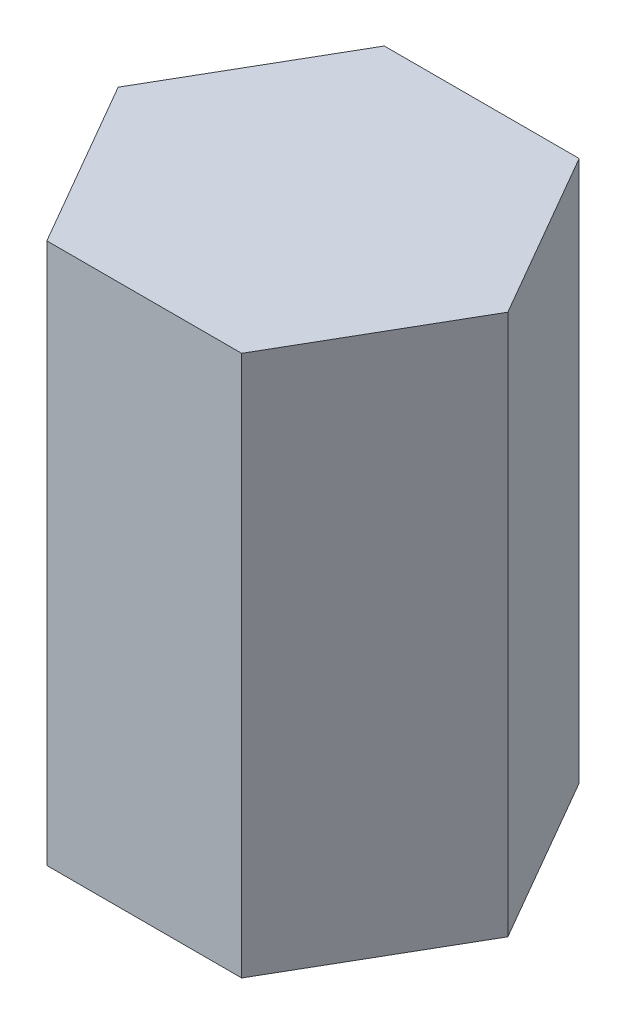
ISO-10303-21;
HEADER;
FILE_DESCRIPTION(('STEP AP214'),'2;1');
FILE_NAME('part.step','',(''),(''),'','','');
FILE_SCHEMA(('AUTOMOTIVE_DESIGN { 1 0 10303 214 1 1 1 1 }'));
ENDSEC;
DATA;
#1=APPLICATION_CONTEXT('core data for automotive mechanical design processes');
#2=APPLICATION_PROTOCOL_DEFINITION('international standard','automotive_design',2000,#1);
#3=PRODUCT_CONTEXT('',#1,'mechanical');
#4=PRODUCT('Part','Part','',(#3));
#5=PRODUCT_RELATED_PRODUCT_CATEGORY('part','',(#4));
#6=PRODUCT_DEFINITION_FORMATION('','',#4);
#7=PRODUCT_DEFINITION_CONTEXT('part definition',#1,'design');
#8=PRODUCT_DEFINITION('design','',#6,#7);
#9=PRODUCT_DEFINITION_SHAPE('','',#8);
#10=(LENGTH_UNIT() NAMED_UNIT(*) SI_UNIT(.MILLI.,.METRE.));
#11=(NAMED_UNIT(*) PLANE_ANGLE_UNIT() SI_UNIT($,.RADIAN.));
#12=(NAMED_UNIT(*) SI_UNIT($,.STERADIAN.) SOLID_ANGLE_UNIT());
#13=UNCERTAINTY_MEASURE_WITH_UNIT(LENGTH_MEASURE(1.E-05),#10,'distance_accuracy_value','');
#14=(GEOMETRIC_REPRESENTATION_CONTEXT(3) GLOBAL_UNCERTAINTY_ASSIGNED_CONTEXT((#13)) GLOBAL_UNIT_ASSIGNED_CONTEXT((#10,
#11,#12)) REPRESENTATION_CONTEXT('',''));
#15=CARTESIAN_POINT('',(0.,0.,0.));
#16=DIRECTION('',(0.,0.,1.));
#17=DIRECTION('',(1.,0.,0.));
#18=AXIS2_PLACEMENT_3D('',#15,#16,#17);
#19=CARTESIAN_POINT('',(288.675134594813,1603.,500.));
#20=DIRECTION('',(-0.866025403784439,0.,-0.5));
#21=DIRECTION('',(-0.5,0.,0.866025403784439));
#22=AXIS2_PLACEMENT_3D('',#19,#20,#21);
#23=PLANE('',#22);
#24=DIRECTION('',(0.5,0.,-0.866025403784439));
#25=VECTOR('',#24,1.);
#26=CARTESIAN_POINT('',(288.675134594813,0.,500.));
#27=LINE('',#26,#25);
#28=CARTESIAN_POINT('',(288.675134594813,0.,500.));
#29=VERTEX_POINT('',#28);
#30=CARTESIAN_POINT('',(577.350269189626,0.,0.));
#31=VERTEX_POINT('',#30);
#32=EDGE_CURVE('E129',#29,#31,#27,.T.);
#33=ORIENTED_EDGE('',*,*,#32,.T.);
#34=DIRECTION('',(0.,-1.,0.));
#35=VECTOR('',#34,1.);
#36=CARTESIAN_POINT('',(577.350269189626,1603.,0.));
#37=LINE('',#36,#35);
#38=CARTESIAN_POINT('',(577.350269189626,1603.,0.));
#39=VERTEX_POINT('',#38);
#40=EDGE_CURVE('E11',#39,#31,#37,.T.);
#41=ORIENTED_EDGE('',*,*,#40,.F.);
#42=DIRECTION('',(0.5,0.,-0.866025403784439));
#43=VECTOR('',#42,1.);
#44=CARTESIAN_POINT('',(288.675134594813,1603.,500.));
#45=LINE('',#44,#43);
#46=CARTESIAN_POINT('',(288.675134594813,1603.,500.));
#47=VERTEX_POINT('',#46);
#48=EDGE_CURVE('E140',#47,#39,#45,.T.);
#49=ORIENTED_EDGE('',*,*,#48,.F.);
#50=DIRECTION('',(0.,-1.,0.));
#51=VECTOR('',#50,1.);
#52=CARTESIAN_POINT('',(288.675134594813,1603.,500.));
#53=LINE('',#52,#51);
#54=EDGE_CURVE('E125',#47,#29,#53,.T.);
#55=ORIENTED_EDGE('',*,*,#54,.T.);
#56=EDGE_LOOP('',(#33,#41,#49,#55));
#57=FACE_BOUND('',#56,.T.);
#58=ADVANCED_FACE('F41',(#57),#23,.F.);
#59=CARTESIAN_POINT('',(577.350269189626,1603.,0.));
#60=DIRECTION('',(-0.866025403784439,0.,0.5));
#61=DIRECTION('',(0.5,0.,0.866025403784439));
#62=AXIS2_PLACEMENT_3D('',#59,#60,#61);
#63=PLANE('',#62);
#64=DIRECTION('',(-0.5,0.,-0.866025403784439));
#65=VECTOR('',#64,1.);
#66=CARTESIAN_POINT('',(577.350269189626,0.,0.));
#67=LINE('',#66,#65);
#68=CARTESIAN_POINT('',(288.675134594813,0.,-500.));
#69=VERTEX_POINT('',#68);
#70=EDGE_CURVE('E132',#31,#69,#67,.T.);
#71=ORIENTED_EDGE('',*,*,#70,.T.);
#72=DIRECTION('',(0.,-1.,0.));
#73=VECTOR('',#72,1.);
#74=CARTESIAN_POINT('',(288.675134594813,1603.,-500.));
#75=LINE('',#74,#73);
#76=CARTESIAN_POINT('',(288.675134594813,1603.,-500.));
#77=VERTEX_POINT('',#76);
#78=EDGE_CURVE('E49',#77,#69,#75,.T.);
#79=ORIENTED_EDGE('',*,*,#78,.F.);
#80=DIRECTION('',(-0.5,0.,-0.866025403784439));
#81=VECTOR('',#80,1.);
#82=CARTESIAN_POINT('',(577.350269189626,1603.,0.));
#83=LINE('',#82,#81);
#84=EDGE_CURVE('E95',#39,#77,#83,.T.);
#85=ORIENTED_EDGE('',*,*,#84,.F.);
#86=ORIENTED_EDGE('',*,*,#40,.T.);
#87=EDGE_LOOP('',(#71,#79,#85,#86));
#88=FACE_BOUND('',#87,.T.);
#89=ADVANCED_FACE('F164',(#88),#63,.F.);
#90=CARTESIAN_POINT('',(288.675134594813,1603.,-500.));
#91=DIRECTION('',(0.,0.,1.));
#92=DIRECTION('',(1.,0.,0.));
#93=AXIS2_PLACEMENT_3D('',#90,#91,#92);
#94=PLANE('',#93);
#95=DIRECTION('',(-1.,0.,0.));
#96=VECTOR('',#95,1.);
#97=CARTESIAN_POINT('',(288.675134594813,0.,-500.));
#98=LINE('',#97,#96);
#99=CARTESIAN_POINT('',(-288.675134594813,0.,-500.));
#100=VERTEX_POINT('',#99);
#101=EDGE_CURVE('E135',#69,#100,#98,.T.);
#102=ORIENTED_EDGE('',*,*,#101,.T.);
#103=DIRECTION('',(0.,-1.,0.));
#104=VECTOR('',#103,1.);
#105=CARTESIAN_POINT('',(-288.675134594813,1603.,-500.));
#106=LINE('',#105,#104);
#107=CARTESIAN_POINT('',(-288.675134594813,1603.,-500.));
#108=VERTEX_POINT('',#107);
#109=EDGE_CURVE('E120',#108,#100,#106,.T.);
#110=ORIENTED_EDGE('',*,*,#109,.F.);
#111=DIRECTION('',(-1.,0.,0.));
#112=VECTOR('',#111,1.);
#113=CARTESIAN_POINT('',(288.675134594813,1603.,-500.));
#114=LINE('',#113,#112);
#115=EDGE_CURVE('E111',#77,#108,#114,.T.);
#116=ORIENTED_EDGE('',*,*,#115,.F.);
#117=ORIENTED_EDGE('',*,*,#78,.T.);
#118=EDGE_LOOP('',(#102,#110,#116,#117));
#119=FACE_BOUND('',#118,.T.);
#120=ADVANCED_FACE('F146',(#119),#94,.F.);
#121=CARTESIAN_POINT('',(-288.675134594813,1603.,-500.));
#122=DIRECTION('',(0.866025403784438,0.,0.5));
#123=DIRECTION('',(0.5,0.,-0.866025403784439));
#124=AXIS2_PLACEMENT_3D('',#121,#122,#123);
#125=PLANE('',#124);
#126=DIRECTION('',(-0.5,0.,0.866025403784439));
#127=VECTOR('',#126,1.);
#128=CARTESIAN_POINT('',(-288.675134594813,0.,-500.));
#129=LINE('',#128,#127);
#130=CARTESIAN_POINT('',(-577.350269189626,0.,-1.66533453693773E-13));
#131=VERTEX_POINT('',#130);
#132=EDGE_CURVE('E119',#100,#131,#129,.T.);
#133=ORIENTED_EDGE('',*,*,#132,.T.);
#134=DIRECTION('',(0.,-1.,0.));
#135=VECTOR('',#134,1.);
#136=CARTESIAN_POINT('',(-577.350269189626,1603.,-1.66533453693773E-13));
#137=LINE('',#136,#135);
#138=CARTESIAN_POINT('',(-577.350269189626,1603.,-1.66533453693773E-13));
#139=VERTEX_POINT('',#138);
#140=EDGE_CURVE('E116',#139,#131,#137,.T.);
#141=ORIENTED_EDGE('',*,*,#140,.F.);
#142=DIRECTION('',(-0.5,0.,0.866025403784439));
#143=VECTOR('',#142,1.);
#144=CARTESIAN_POINT('',(-288.675134594813,1603.,-500.));
#145=LINE('',#144,#143);
#146=EDGE_CURVE('E105',#108,#139,#145,.T.);
#147=ORIENTED_EDGE('',*,*,#146,.F.);
#148=ORIENTED_EDGE('',*,*,#109,.T.);
#149=EDGE_LOOP('',(#133,#141,#147,#148));
#150=FACE_BOUND('',#149,.T.);
#151=ADVANCED_FACE('F117',(#150),#125,.F.);
#152=CARTESIAN_POINT('',(-577.350269189626,1603.,-1.66533453693773E-13));
#153=DIRECTION('',(0.866025403784439,0.,-0.5));
#154=DIRECTION('',(-0.5,0.,-0.866025403784439));
#155=AXIS2_PLACEMENT_3D('',#152,#153,#154);
#156=PLANE('',#155);
#157=DIRECTION('',(0.5,0.,0.866025403784439));
#158=VECTOR('',#157,1.);
#159=CARTESIAN_POINT('',(-577.350269189626,0.,-1.66533453693773E-13));
#160=LINE('',#159,#158);
#161=CARTESIAN_POINT('',(-288.675134594813,0.,500.));
#162=VERTEX_POINT('',#161);
#163=EDGE_CURVE('E81',#131,#162,#160,.T.);
#164=ORIENTED_EDGE('',*,*,#163,.T.);
#165=DIRECTION('',(0.,-1.,0.));
#166=VECTOR('',#165,1.);
#167=CARTESIAN_POINT('',(-288.675134594813,1603.,500.));
#168=LINE('',#167,#166);
#169=CARTESIAN_POINT('',(-288.675134594813,1603.,500.));
#170=VERTEX_POINT('',#169);
#171=EDGE_CURVE('E121',#170,#162,#168,.T.);
#172=ORIENTED_EDGE('',*,*,#171,.F.);
#173=DIRECTION('',(0.5,0.,0.866025403784439));
#174=VECTOR('',#173,1.);
#175=CARTESIAN_POINT('',(-577.350269189626,1603.,-1.66533453693773E-13));
#176=LINE('',#175,#174);
#177=EDGE_CURVE('E109',#139,#170,#176,.T.);
#178=ORIENTED_EDGE('',*,*,#177,.F.);
#179=ORIENTED_EDGE('',*,*,#140,.T.);
#180=EDGE_LOOP('',(#164,#172,#178,#179));
#181=FACE_BOUND('',#180,.T.);
#182=ADVANCED_FACE('F123',(#181),#156,.F.);
#183=CARTESIAN_POINT('',(-288.675134594813,1603.,500.));
#184=DIRECTION('',(0.,0.,-1.));
#185=DIRECTION('',(-1.,0.,0.));
#186=AXIS2_PLACEMENT_3D('',#183,#184,#185);
#187=PLANE('',#186);
#188=DIRECTION('',(1.,0.,0.));
#189=VECTOR('',#188,1.);
#190=CARTESIAN_POINT('',(-288.675134594813,0.,500.));
#191=LINE('',#190,#189);
#192=EDGE_CURVE('E87',#162,#29,#191,.T.);
#193=ORIENTED_EDGE('',*,*,#192,.T.);
#194=ORIENTED_EDGE('',*,*,#54,.F.);
#195=DIRECTION('',(1.,0.,0.));
#196=VECTOR('',#195,1.);
#197=CARTESIAN_POINT('',(-288.675134594813,1603.,500.));
#198=LINE('',#197,#196);
#199=EDGE_CURVE('E57',#170,#47,#198,.T.);
#200=ORIENTED_EDGE('',*,*,#199,.F.);
#201=ORIENTED_EDGE('',*,*,#171,.T.);
#202=EDGE_LOOP('',(#193,#194,#200,#201));
#203=FACE_BOUND('',#202,.T.);
#204=ADVANCED_FACE('F153',(#203),#187,.F.);
#205=CARTESIAN_POINT('',(0.,1603.,0.));
#206=DIRECTION('',(0.,1.,0.));
#207=DIRECTION('',(0.,0.,1.));
#208=AXIS2_PLACEMENT_3D('',#205,#206,#207);
#209=PLANE('',#208);
#210=ORIENTED_EDGE('',*,*,#48,.T.);
#211=ORIENTED_EDGE('',*,*,#84,.T.);
#212=ORIENTED_EDGE('',*,*,#115,.T.);
#213=ORIENTED_EDGE('',*,*,#146,.T.);
#214=ORIENTED_EDGE('',*,*,#177,.T.);
#215=ORIENTED_EDGE('',*,*,#199,.T.);
#216=EDGE_LOOP('',(#210,#211,#212,#213,#214,#215));
#217=FACE_BOUND('',#216,.T.);
#218=ADVANCED_FACE('F107',(#217),#209,.T.);
#219=CARTESIAN_POINT('',(0.,0.,0.));
#220=DIRECTION('',(0.,1.,0.));
#221=DIRECTION('',(0.,0.,1.));
#222=AXIS2_PLACEMENT_3D('',#219,#220,#221);
#223=PLANE('',#222);
#224=ORIENTED_EDGE('',*,*,#32,.F.);
#225=ORIENTED_EDGE('',*,*,#192,.F.);
#226=ORIENTED_EDGE('',*,*,#163,.F.);
#227=ORIENTED_EDGE('',*,*,#132,.F.);
#228=ORIENTED_EDGE('',*,*,#101,.F.);
#229=ORIENTED_EDGE('',*,*,#70,.F.);
#230=EDGE_LOOP('',(#224,#225,#226,#227,#228,#229));
#231=FACE_BOUND('',#230,.T.);
#232=ADVANCED_FACE('F149',(#231),#223,.F.);
#233=CLOSED_SHELL('',(#58,#89,#120,#151,#182,#204,#218,#232));
#234=CARTESIAN_POINT('',(287.520434056434,1601.05,498.));
#235=DIRECTION('',(-0.866025403784439,0.,-0.499999999999999));
#236=DIRECTION('',(-0.499999999999999,0.,0.866025403784439));
#237=AXIS2_PLACEMENT_3D('',#234,#235,#236);
#238=PLANE('',#237);
#239=DIRECTION('',(0.499999999999999,0.,-0.866025403784439));
#240=VECTOR('',#239,1.);
#241=CARTESIAN_POINT('',(287.520434056434,400.75,498.));
#242=LINE('',#241,#240);
#243=CARTESIAN_POINT('',(287.520434056434,400.75,498.));
#244=VERTEX_POINT('',#243);
#245=CARTESIAN_POINT('',(575.040868112867,400.75,-2.22044516620346E-13));
#246=VERTEX_POINT('',#245);
#247=EDGE_CURVE('E336',#244,#246,#242,.T.);
#248=ORIENTED_EDGE('',*,*,#247,.F.);
#249=DIRECTION('',(0.,-1.,0.));
#250=VECTOR('',#249,1.);
#251=CARTESIAN_POINT('',(287.520434056434,1601.05,498.));
#252=LINE('',#251,#250);
#253=CARTESIAN_POINT('',(287.520434056434,1601.05,498.));
#254=VERTEX_POINT('',#253);
#255=EDGE_CURVE('E364',#254,#244,#252,.T.);
#256=ORIENTED_EDGE('',*,*,#255,.F.);
#257=DIRECTION('',(0.499999999999999,0.,-0.866025403784439));
#258=VECTOR('',#257,1.);
#259=CARTESIAN_POINT('',(287.520434056434,1601.05,498.));
#260=LINE('',#259,#258);
#261=CARTESIAN_POINT('',(575.040868112867,1601.05,-2.22044516620346E-13));
#262=VERTEX_POINT('',#261);
#263=EDGE_CURVE('E363',#254,#262,#260,.T.);
#264=ORIENTED_EDGE('',*,*,#263,.T.);
#265=DIRECTION('',(0.,-1.,0.));
#266=VECTOR('',#265,1.);
#267=CARTESIAN_POINT('',(575.040868112867,1601.05,-2.22044516620346E-13));
#268=LINE('',#267,#266);
#269=EDGE_CURVE('E133',#262,#246,#268,.T.);
#270=ORIENTED_EDGE('',*,*,#269,.T.);
#271=EDGE_LOOP('',(#248,#256,#264,#270));
#272=FACE_BOUND('',#271,.T.);
#273=ADVANCED_FACE('F210',(#272),#238,.T.);
#274=CARTESIAN_POINT('',(575.040868112867,1601.05,-2.22044516620346E-13));
#275=DIRECTION('',(-0.866025403784439,0.,0.5));
#276=DIRECTION('',(0.5,0.,0.866025403784439));
#277=AXIS2_PLACEMENT_3D('',#274,#275,#276);
#278=PLANE('',#277);
#279=DIRECTION('',(-0.5,0.,-0.866025403784439));
#280=VECTOR('',#279,1.);
#281=CARTESIAN_POINT('',(575.040868112867,400.75,-2.22044516620346E-13));
#282=LINE('',#281,#280);
#283=CARTESIAN_POINT('',(287.520434056434,400.75,-498.));
#284=VERTEX_POINT('',#283);
#285=EDGE_CURVE('E340',#246,#284,#282,.T.);
#286=ORIENTED_EDGE('',*,*,#285,.F.);
#287=ORIENTED_EDGE('',*,*,#269,.F.);
#288=DIRECTION('',(-0.5,0.,-0.866025403784439));
#289=VECTOR('',#288,1.);
#290=CARTESIAN_POINT('',(575.040868112867,1601.05,-2.22044516620346E-13));
#291=LINE('',#290,#289);
#292=CARTESIAN_POINT('',(287.520434056434,1601.05,-498.));
#293=VERTEX_POINT('',#292);
#294=EDGE_CURVE('E386',#262,#293,#291,.T.);
#295=ORIENTED_EDGE('',*,*,#294,.T.);
#296=DIRECTION('',(0.,-1.,0.));
#297=VECTOR('',#296,1.);
#298=CARTESIAN_POINT('',(287.520434056434,1601.05,-498.));
#299=LINE('',#298,#297);
#300=EDGE_CURVE('E375',#293,#284,#299,.T.);
#301=ORIENTED_EDGE('',*,*,#300,.T.);
#302=EDGE_LOOP('',(#286,#287,#295,#301));
#303=FACE_BOUND('',#302,.T.);
#304=ADVANCED_FACE('F213',(#303),#278,.T.);
#305=CARTESIAN_POINT('',(287.520434056434,1601.05,-498.));
#306=DIRECTION('',(0.,0.,1.));
#307=DIRECTION('',(1.,0.,0.));
#308=AXIS2_PLACEMENT_3D('',#305,#306,#307);
#309=PLANE('',#308);
#310=DIRECTION('',(-1.,0.,0.));
#311=VECTOR('',#310,1.);
#312=CARTESIAN_POINT('',(287.520434056434,400.75,-498.));
#313=LINE('',#312,#311);
#314=CARTESIAN_POINT('',(-287.520434056434,400.75,-498.));
#315=VERTEX_POINT('',#314);
#316=EDGE_CURVE('E350',#284,#315,#313,.T.);
#317=ORIENTED_EDGE('',*,*,#316,.F.);
#318=ORIENTED_EDGE('',*,*,#300,.F.);
#319=DIRECTION('',(-1.,0.,0.));
#320=VECTOR('',#319,1.);
#321=CARTESIAN_POINT('',(287.520434056434,1601.05,-498.));
#322=LINE('',#321,#320);
#323=CARTESIAN_POINT('',(-287.520434056434,1601.05,-498.));
#324=VERTEX_POINT('',#323);
#325=EDGE_CURVE('E416',#293,#324,#322,.T.);
#326=ORIENTED_EDGE('',*,*,#325,.T.);
#327=DIRECTION('',(0.,-1.,0.));
#328=VECTOR('',#327,1.);
#329=CARTESIAN_POINT('',(-287.520434056434,1601.05,-498.));
#330=LINE('',#329,#328);
#331=EDGE_CURVE('E372',#324,#315,#330,.T.);
#332=ORIENTED_EDGE('',*,*,#331,.T.);
#333=EDGE_LOOP('',(#317,#318,#326,#332));
#334=FACE_BOUND('',#333,.T.);
#335=ADVANCED_FACE('F225',(#334),#309,.T.);
#336=CARTESIAN_POINT('',(-287.520434056434,1601.05,-498.));
#337=DIRECTION('',(0.866025403784439,0.,0.5));
#338=DIRECTION('',(0.5,0.,-0.866025403784439));
#339=AXIS2_PLACEMENT_3D('',#336,#337,#338);
#340=PLANE('',#339);
#341=DIRECTION('',(-0.5,0.,0.866025403784439));
#342=VECTOR('',#341,1.);
#343=CARTESIAN_POINT('',(-287.520434056434,400.75,-498.));
#344=LINE('',#343,#342);
#345=CARTESIAN_POINT('',(-575.040868112867,400.75,1.11117472057605E-13));
#346=VERTEX_POINT('',#345);
#347=EDGE_CURVE('E357',#315,#346,#344,.T.);
#348=ORIENTED_EDGE('',*,*,#347,.F.);
#349=ORIENTED_EDGE('',*,*,#331,.F.);
#350=DIRECTION('',(-0.5,0.,0.866025403784439));
#351=VECTOR('',#350,1.);
#352=CARTESIAN_POINT('',(-287.520434056434,1601.05,-498.));
#353=LINE('',#352,#351);
#354=CARTESIAN_POINT('',(-575.040868112867,1601.05,1.11117472057605E-13));
#355=VERTEX_POINT('',#354);
#356=EDGE_CURVE('E420',#324,#355,#353,.T.);
#357=ORIENTED_EDGE('',*,*,#356,.T.);
#358=DIRECTION('',(0.,-1.,0.));
#359=VECTOR('',#358,1.);
#360=CARTESIAN_POINT('',(-575.040868112867,1601.05,1.11117472057605E-13));
#361=LINE('',#360,#359);
#362=EDGE_CURVE('E369',#355,#346,#361,.T.);
#363=ORIENTED_EDGE('',*,*,#362,.T.);
#364=EDGE_LOOP('',(#348,#349,#357,#363));
#365=FACE_BOUND('',#364,.T.);
#366=ADVANCED_FACE('F236',(#365),#340,.T.);
#367=CARTESIAN_POINT('',(-575.040868112867,1601.05,1.11117472057605E-13));
#368=DIRECTION('',(0.866025403784439,0.,-0.5));
#369=DIRECTION('',(-0.5,0.,-0.866025403784439));
#370=AXIS2_PLACEMENT_3D('',#367,#368,#369);
#371=PLANE('',#370);
#372=DIRECTION('',(0.5,0.,0.866025403784438));
#373=VECTOR('',#372,1.);
#374=CARTESIAN_POINT('',(-575.040868112867,400.75,1.11117472057605E-13));
#375=LINE('',#374,#373);
#376=CARTESIAN_POINT('',(-287.520434056434,400.75,498.));
#377=VERTEX_POINT('',#376);
#378=EDGE_CURVE('E360',#346,#377,#375,.T.);
#379=ORIENTED_EDGE('',*,*,#378,.F.);
#380=ORIENTED_EDGE('',*,*,#362,.F.);
#381=DIRECTION('',(0.5,0.,0.866025403784438));
#382=VECTOR('',#381,1.);
#383=CARTESIAN_POINT('',(-575.040868112867,1601.05,1.11117472057605E-13));
#384=LINE('',#383,#382);
#385=CARTESIAN_POINT('',(-287.520434056434,1601.05,498.));
#386=VERTEX_POINT('',#385);
#387=EDGE_CURVE('E413',#355,#386,#384,.T.);
#388=ORIENTED_EDGE('',*,*,#387,.T.);
#389=DIRECTION('',(0.,-1.,0.));
#390=VECTOR('',#389,1.);
#391=CARTESIAN_POINT('',(-287.520434056434,1601.05,498.));
#392=LINE('',#391,#390);
#393=EDGE_CURVE('E366',#386,#377,#392,.T.);
#394=ORIENTED_EDGE('',*,*,#393,.T.);
#395=EDGE_LOOP('',(#379,#380,#388,#394));
#396=FACE_BOUND('',#395,.T.);
#397=ADVANCED_FACE('F247',(#396),#371,.T.);
#398=CARTESIAN_POINT('',(-287.520434056434,1601.05,498.));
#399=DIRECTION('',(0.,0.,-1.));
#400=DIRECTION('',(-1.,0.,0.));
#401=AXIS2_PLACEMENT_3D('',#398,#399,#400);
#402=PLANE('',#401);
#403=DIRECTION('',(1.,0.,0.));
#404=VECTOR('',#403,1.);
#405=CARTESIAN_POINT('',(-287.520434056434,400.75,498.));
#406=LINE('',#405,#404);
#407=EDGE_CURVE('E344',#377,#244,#406,.T.);
#408=ORIENTED_EDGE('',*,*,#407,.F.);
#409=ORIENTED_EDGE('',*,*,#393,.F.);
#410=DIRECTION('',(1.,0.,0.));
#411=VECTOR('',#410,1.);
#412=CARTESIAN_POINT('',(-287.520434056434,1601.05,498.));
#413=LINE('',#412,#411);
#414=EDGE_CURVE('E353',#386,#254,#413,.T.);
#415=ORIENTED_EDGE('',*,*,#414,.T.);
#416=ORIENTED_EDGE('',*,*,#255,.T.);
#417=EDGE_LOOP('',(#408,#409,#415,#416));
#418=FACE_BOUND('',#417,.T.);
#419=ADVANCED_FACE('F258',(#418),#402,.T.);
#420=CARTESIAN_POINT('',(0.,1601.05,0.));
#421=DIRECTION('',(0.,1.,0.));
#422=DIRECTION('',(0.,0.,1.));
#423=AXIS2_PLACEMENT_3D('',#420,#421,#422);
#424=PLANE('',#423);
#425=ORIENTED_EDGE('',*,*,#263,.F.);
#426=ORIENTED_EDGE('',*,*,#414,.F.);
#427=ORIENTED_EDGE('',*,*,#387,.F.);
#428=ORIENTED_EDGE('',*,*,#356,.F.);
#429=ORIENTED_EDGE('',*,*,#325,.F.);
#430=ORIENTED_EDGE('',*,*,#294,.F.);
#431=EDGE_LOOP('',(#425,#426,#427,#428,#429,#430));
#432=FACE_BOUND('',#431,.T.);
#433=ADVANCED_FACE('F269',(#432),#424,.F.);
#434=CARTESIAN_POINT('',(0.,400.75,0.));
#435=DIRECTION('',(0.,1.,0.));
#436=DIRECTION('',(0.,0.,1.));
#437=AXIS2_PLACEMENT_3D('',#434,#435,#436);
#438=PLANE('',#437);
#439=ORIENTED_EDGE('',*,*,#247,.T.);
#440=ORIENTED_EDGE('',*,*,#285,.T.);
#441=ORIENTED_EDGE('',*,*,#316,.T.);
#442=ORIENTED_EDGE('',*,*,#347,.T.);
#443=ORIENTED_EDGE('',*,*,#378,.T.);
#444=ORIENTED_EDGE('',*,*,#407,.T.);
#445=EDGE_LOOP('',(#439,#440,#441,#442,#443,#444));
#446=FACE_BOUND('',#445,.T.);
#447=ADVANCED_FACE('F280',(#446),#438,.T.);
#448=CLOSED_SHELL('',(#273,#304,#335,#366,#397,#419,#433,#447));
#449=ORIENTED_CLOSED_SHELL('',*,#448,.T.);
#450=BREP_WITH_VOIDS('B2',#233,(#449));
#451=ADVANCED_BREP_SHAPE_REPRESENTATION('',(#18,#450),#14);
#452=SHAPE_DEFINITION_REPRESENTATION(#9,#451);
ENDSEC;
END-ISO-10303-21;
